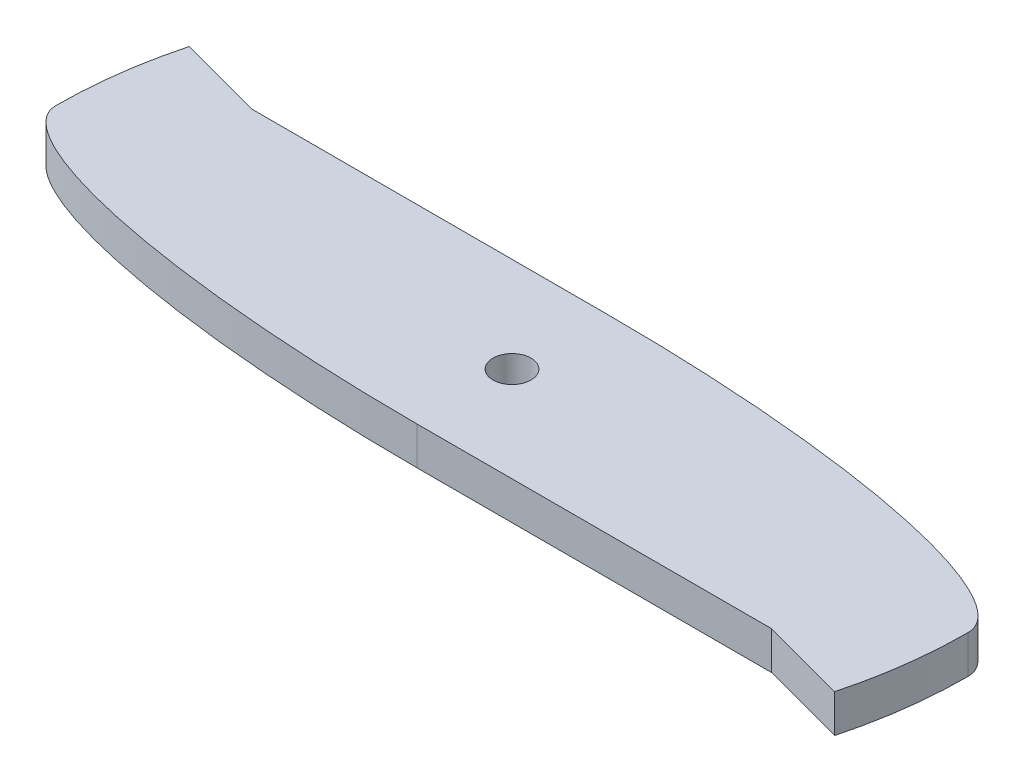
ISO-10303-21;
HEADER;
FILE_DESCRIPTION(('STEP AP214'),'2;1');
FILE_NAME('part.step','',(''),(''),'','','');
FILE_SCHEMA(('AUTOMOTIVE_DESIGN { 1 0 10303 214 1 1 1 1 }'));
ENDSEC;
DATA;
#1=APPLICATION_CONTEXT('core data for automotive mechanical design processes');
#2=APPLICATION_PROTOCOL_DEFINITION('international standard','automotive_design',2000,#1);
#3=PRODUCT_CONTEXT('',#1,'mechanical');
#4=PRODUCT('Part','Part','',(#3));
#5=PRODUCT_RELATED_PRODUCT_CATEGORY('part','',(#4));
#6=PRODUCT_DEFINITION_FORMATION('','',#4);
#7=PRODUCT_DEFINITION_CONTEXT('part definition',#1,'design');
#8=PRODUCT_DEFINITION('design','',#6,#7);
#9=PRODUCT_DEFINITION_SHAPE('','',#8);
#10=(LENGTH_UNIT() NAMED_UNIT(*) SI_UNIT(.MILLI.,.METRE.));
#11=(NAMED_UNIT(*) PLANE_ANGLE_UNIT() SI_UNIT($,.RADIAN.));
#12=(NAMED_UNIT(*) SI_UNIT($,.STERADIAN.) SOLID_ANGLE_UNIT());
#13=UNCERTAINTY_MEASURE_WITH_UNIT(LENGTH_MEASURE(1.E-05),#10,'distance_accuracy_value','');
#14=(GEOMETRIC_REPRESENTATION_CONTEXT(3) GLOBAL_UNCERTAINTY_ASSIGNED_CONTEXT((#13)) GLOBAL_UNIT_ASSIGNED_CONTEXT((#10,
#11,#12)) REPRESENTATION_CONTEXT('',''));
#15=CARTESIAN_POINT('',(0.,0.,0.));
#16=DIRECTION('',(0.,0.,1.));
#17=DIRECTION('',(1.,0.,0.));
#18=AXIS2_PLACEMENT_3D('',#15,#16,#17);
#19=CARTESIAN_POINT('',(0.,3.175,0.));
#20=DIRECTION('',(0.,1.,0.));
#21=DIRECTION('',(0.,0.,1.));
#22=AXIS2_PLACEMENT_3D('',#19,#20,#21);
#23=PLANE('',#22);
#24=CARTESIAN_POINT('',(0.,3.175,0.));
#25=DIRECTION('',(0.,1.,0.));
#26=DIRECTION('',(-1.,0.,0.));
#27=AXIS2_PLACEMENT_3D('',#24,#25,#26);
#28=ELLIPSE('',#27,76.2,15.875);
#29=CARTESIAN_POINT('',(76.2,3.175,0.));
#30=VERTEX_POINT('',#29);
#31=CARTESIAN_POINT('',(0.,3.175,-15.875));
#32=VERTEX_POINT('',#31);
#33=EDGE_CURVE('E146',#30,#32,#28,.T.);
#34=ORIENTED_EDGE('',*,*,#33,.T.);
#35=DIRECTION('',(-1.,0.,0.));
#36=VECTOR('',#35,1.);
#37=CARTESIAN_POINT('',(0.,3.175,-15.875));
#38=LINE('',#37,#36);
#39=CARTESIAN_POINT('',(-59.2463065701573,3.175,-15.875));
#40=VERTEX_POINT('',#39);
#41=EDGE_CURVE('E94',#32,#40,#38,.T.);
#42=ORIENTED_EDGE('',*,*,#41,.T.);
#43=DIRECTION('',(-0.96592582628907,0.,-0.258819045102513));
#44=VECTOR('',#43,1.);
#45=CARTESIAN_POINT('',(-59.2463065701573,3.175,-15.875));
#46=LINE('',#45,#44);
#47=CARTESIAN_POINT('',(-73.6035479632271,3.175,-19.7220112368116));
#48=VERTEX_POINT('',#47);
#49=EDGE_CURVE('E161',#40,#48,#46,.T.);
#50=ORIENTED_EDGE('',*,*,#49,.T.);
#51=CARTESIAN_POINT('',(0.,3.175,0.));
#52=DIRECTION('',(0.,1.,0.));
#53=DIRECTION('',(0.,0.,-1.));
#54=AXIS2_PLACEMENT_3D('',#51,#52,#53);
#55=CIRCLE('',#54,76.2);
#56=CARTESIAN_POINT('',(-76.2,3.175,0.));
#57=VERTEX_POINT('',#56);
#58=EDGE_CURVE('E174',#48,#57,#55,.T.);
#59=ORIENTED_EDGE('',*,*,#58,.T.);
#60=CARTESIAN_POINT('',(0.,3.175,0.));
#61=DIRECTION('',(0.,1.,0.));
#62=DIRECTION('',(1.,0.,0.));
#63=AXIS2_PLACEMENT_3D('',#60,#61,#62);
#64=ELLIPSE('',#63,76.2,15.875);
#65=CARTESIAN_POINT('',(0.,3.175,15.875));
#66=VERTEX_POINT('',#65);
#67=EDGE_CURVE('E113',#57,#66,#64,.T.);
#68=ORIENTED_EDGE('',*,*,#67,.T.);
#69=DIRECTION('',(1.,0.,0.));
#70=VECTOR('',#69,1.);
#71=CARTESIAN_POINT('',(0.,3.175,15.875));
#72=LINE('',#71,#70);
#73=CARTESIAN_POINT('',(59.2463065701575,3.175,15.875));
#74=VERTEX_POINT('',#73);
#75=EDGE_CURVE('E107',#66,#74,#72,.T.);
#76=ORIENTED_EDGE('',*,*,#75,.T.);
#77=DIRECTION('',(0.96592582628907,0.,0.258819045102515));
#78=VECTOR('',#77,1.);
#79=CARTESIAN_POINT('',(59.2463065701575,3.175,15.875));
#80=LINE('',#79,#78);
#81=CARTESIAN_POINT('',(73.6035479632271,3.175,19.7220112368116));
#82=VERTEX_POINT('',#81);
#83=EDGE_CURVE('E111',#74,#82,#80,.T.);
#84=ORIENTED_EDGE('',*,*,#83,.T.);
#85=CARTESIAN_POINT('',(0.,3.175,0.));
#86=DIRECTION('',(0.,1.,0.));
#87=DIRECTION('',(0.,0.,-1.));
#88=AXIS2_PLACEMENT_3D('',#85,#86,#87);
#89=CIRCLE('',#88,76.2);
#90=EDGE_CURVE('E51',#82,#30,#89,.T.);
#91=ORIENTED_EDGE('',*,*,#90,.T.);
#92=EDGE_LOOP('',(#34,#42,#50,#59,#68,#76,#84,#91));
#93=FACE_BOUND('',#92,.T.);
#94=CARTESIAN_POINT('',(0.,3.175,0.));
#95=DIRECTION('',(0.,1.,0.));
#96=DIRECTION('',(0.,0.,1.));
#97=AXIS2_PLACEMENT_3D('',#94,#95,#96);
#98=CIRCLE('',#97,3.175);
#99=CARTESIAN_POINT('',(0.,3.175,3.175));
#100=VERTEX_POINT('',#99);
#101=EDGE_CURVE('E135',#100,#100,#98,.T.);
#102=ORIENTED_EDGE('',*,*,#101,.F.);
#103=EDGE_LOOP('',(#102));
#104=FACE_BOUND('',#103,.T.);
#105=ADVANCED_FACE('F33',(#93,#104),#23,.T.);
#106=CARTESIAN_POINT('',(0.,-3.175,0.));
#107=DIRECTION('',(0.,1.,0.));
#108=DIRECTION('',(0.,0.,1.));
#109=AXIS2_PLACEMENT_3D('',#106,#107,#108);
#110=PLANE('',#109);
#111=CARTESIAN_POINT('',(0.,-3.175,0.));
#112=DIRECTION('',(0.,1.,0.));
#113=DIRECTION('',(-1.,0.,0.));
#114=AXIS2_PLACEMENT_3D('',#111,#112,#113);
#115=ELLIPSE('',#114,76.2,15.875);
#116=CARTESIAN_POINT('',(76.2,-3.175,0.));
#117=VERTEX_POINT('',#116);
#118=CARTESIAN_POINT('',(0.,-3.175,-15.875));
#119=VERTEX_POINT('',#118);
#120=EDGE_CURVE('E131',#117,#119,#115,.T.);
#121=ORIENTED_EDGE('',*,*,#120,.F.);
#122=CARTESIAN_POINT('',(0.,-3.175,0.));
#123=DIRECTION('',(0.,1.,0.));
#124=DIRECTION('',(0.,0.,-1.));
#125=AXIS2_PLACEMENT_3D('',#122,#123,#124);
#126=CIRCLE('',#125,76.2);
#127=CARTESIAN_POINT('',(73.6035479632271,-3.175,19.7220112368116));
#128=VERTEX_POINT('',#127);
#129=EDGE_CURVE('E86',#128,#117,#126,.T.);
#130=ORIENTED_EDGE('',*,*,#129,.F.);
#131=DIRECTION('',(0.96592582628907,0.,0.258819045102515));
#132=VECTOR('',#131,1.);
#133=CARTESIAN_POINT('',(59.2463065701575,-3.175,15.875));
#134=LINE('',#133,#132);
#135=CARTESIAN_POINT('',(59.2463065701575,-3.175,15.875));
#136=VERTEX_POINT('',#135);
#137=EDGE_CURVE('E80',#136,#128,#134,.T.);
#138=ORIENTED_EDGE('',*,*,#137,.F.);
#139=DIRECTION('',(1.,0.,0.));
#140=VECTOR('',#139,1.);
#141=CARTESIAN_POINT('',(0.,-3.175,15.875));
#142=LINE('',#141,#140);
#143=CARTESIAN_POINT('',(0.,-3.175,15.875));
#144=VERTEX_POINT('',#143);
#145=EDGE_CURVE('E121',#144,#136,#142,.T.);
#146=ORIENTED_EDGE('',*,*,#145,.F.);
#147=CARTESIAN_POINT('',(0.,-3.175,0.));
#148=DIRECTION('',(0.,1.,0.));
#149=DIRECTION('',(1.,0.,0.));
#150=AXIS2_PLACEMENT_3D('',#147,#148,#149);
#151=ELLIPSE('',#150,76.2,15.875);
#152=CARTESIAN_POINT('',(-76.2,-3.175,0.));
#153=VERTEX_POINT('',#152);
#154=EDGE_CURVE('E141',#153,#144,#151,.T.);
#155=ORIENTED_EDGE('',*,*,#154,.F.);
#156=CARTESIAN_POINT('',(0.,-3.175,0.));
#157=DIRECTION('',(0.,1.,0.));
#158=DIRECTION('',(0.,0.,-1.));
#159=AXIS2_PLACEMENT_3D('',#156,#157,#158);
#160=CIRCLE('',#159,76.2);
#161=CARTESIAN_POINT('',(-73.6035479632271,-3.175,-19.7220112368116));
#162=VERTEX_POINT('',#161);
#163=EDGE_CURVE('E139',#162,#153,#160,.T.);
#164=ORIENTED_EDGE('',*,*,#163,.F.);
#165=DIRECTION('',(-0.96592582628907,0.,-0.258819045102513));
#166=VECTOR('',#165,1.);
#167=CARTESIAN_POINT('',(-59.2463065701573,-3.175,-15.875));
#168=LINE('',#167,#166);
#169=CARTESIAN_POINT('',(-59.2463065701573,-3.175,-15.875));
#170=VERTEX_POINT('',#169);
#171=EDGE_CURVE('E137',#170,#162,#168,.T.);
#172=ORIENTED_EDGE('',*,*,#171,.F.);
#173=DIRECTION('',(-1.,0.,0.));
#174=VECTOR('',#173,1.);
#175=CARTESIAN_POINT('',(0.,-3.175,-15.875));
#176=LINE('',#175,#174);
#177=EDGE_CURVE('E134',#119,#170,#176,.T.);
#178=ORIENTED_EDGE('',*,*,#177,.F.);
#179=EDGE_LOOP('',(#121,#130,#138,#146,#155,#164,#172,#178));
#180=FACE_BOUND('',#179,.T.);
#181=CARTESIAN_POINT('',(0.,-3.175,0.));
#182=DIRECTION('',(0.,1.,0.));
#183=DIRECTION('',(0.,0.,1.));
#184=AXIS2_PLACEMENT_3D('',#181,#182,#183);
#185=CIRCLE('',#184,3.175);
#186=CARTESIAN_POINT('',(0.,-3.175,3.175));
#187=VERTEX_POINT('',#186);
#188=EDGE_CURVE('E274',#187,#187,#185,.T.);
#189=ORIENTED_EDGE('',*,*,#188,.T.);
#190=EDGE_LOOP('',(#189));
#191=FACE_BOUND('',#190,.T.);
#192=ADVANCED_FACE('F165',(#180,#191),#110,.F.);
#193=DIRECTION('',(0.,-1.,0.));
#194=VECTOR('',#193,1.);
#195=SURFACE_OF_LINEAR_EXTRUSION('',#28,#194);
#196=ORIENTED_EDGE('',*,*,#120,.T.);
#197=DIRECTION('',(0.,-1.,0.));
#198=VECTOR('',#197,1.);
#199=CARTESIAN_POINT('',(0.,3.175,-15.875));
#200=LINE('',#199,#198);
#201=EDGE_CURVE('E11',#32,#119,#200,.T.);
#202=ORIENTED_EDGE('',*,*,#201,.F.);
#203=ORIENTED_EDGE('',*,*,#33,.F.);
#204=DIRECTION('',(0.,-1.,0.));
#205=VECTOR('',#204,1.);
#206=CARTESIAN_POINT('',(76.2,3.175,0.));
#207=LINE('',#206,#205);
#208=EDGE_CURVE('E127',#30,#117,#207,.T.);
#209=ORIENTED_EDGE('',*,*,#208,.T.);
#210=EDGE_LOOP('',(#196,#202,#203,#209));
#211=FACE_BOUND('',#210,.T.);
#212=ADVANCED_FACE('F35',(#211),#195,.F.);
#213=CARTESIAN_POINT('',(0.,3.175,-15.875));
#214=DIRECTION('',(0.,0.,1.));
#215=DIRECTION('',(1.,0.,0.));
#216=AXIS2_PLACEMENT_3D('',#213,#214,#215);
#217=PLANE('',#216);
#218=ORIENTED_EDGE('',*,*,#177,.T.);
#219=DIRECTION('',(0.,-1.,0.));
#220=VECTOR('',#219,1.);
#221=CARTESIAN_POINT('',(-59.2463065701573,3.175,-15.875));
#222=LINE('',#221,#220);
#223=EDGE_CURVE('E43',#40,#170,#222,.T.);
#224=ORIENTED_EDGE('',*,*,#223,.F.);
#225=ORIENTED_EDGE('',*,*,#41,.F.);
#226=ORIENTED_EDGE('',*,*,#201,.T.);
#227=EDGE_LOOP('',(#218,#224,#225,#226));
#228=FACE_BOUND('',#227,.T.);
#229=ADVANCED_FACE('F186',(#228),#217,.F.);
#230=CARTESIAN_POINT('',(-59.2463065701573,3.175,-15.875));
#231=DIRECTION('',(-0.258819045102513,0.,0.96592582628907));
#232=DIRECTION('',(0.965925826289071,0.,0.258819045102513));
#233=AXIS2_PLACEMENT_3D('',#230,#231,#232);
#234=PLANE('',#233);
#235=ORIENTED_EDGE('',*,*,#171,.T.);
#236=DIRECTION('',(0.,-1.,0.));
#237=VECTOR('',#236,1.);
#238=CARTESIAN_POINT('',(-73.6035479632271,3.175,-19.7220112368116));
#239=LINE('',#238,#237);
#240=EDGE_CURVE('E153',#48,#162,#239,.T.);
#241=ORIENTED_EDGE('',*,*,#240,.F.);
#242=ORIENTED_EDGE('',*,*,#49,.F.);
#243=ORIENTED_EDGE('',*,*,#223,.T.);
#244=EDGE_LOOP('',(#235,#241,#242,#243));
#245=FACE_BOUND('',#244,.T.);
#246=ADVANCED_FACE('F159',(#245),#234,.F.);
#247=CARTESIAN_POINT('',(0.,3.175,0.));
#248=DIRECTION('',(0.,-1.,0.));
#249=DIRECTION('',(0.,0.,-1.));
#250=AXIS2_PLACEMENT_3D('',#247,#248,#249);
#251=CYLINDRICAL_SURFACE('',#250,76.2);
#252=ORIENTED_EDGE('',*,*,#163,.T.);
#253=DIRECTION('',(0.,-1.,0.));
#254=VECTOR('',#253,1.);
#255=CARTESIAN_POINT('',(-76.2,3.175,0.));
#256=LINE('',#255,#254);
#257=EDGE_CURVE('E150',#57,#153,#256,.T.);
#258=ORIENTED_EDGE('',*,*,#257,.F.);
#259=ORIENTED_EDGE('',*,*,#58,.F.);
#260=ORIENTED_EDGE('',*,*,#240,.T.);
#261=EDGE_LOOP('',(#252,#258,#259,#260));
#262=FACE_BOUND('',#261,.T.);
#263=ADVANCED_FACE('F170',(#262),#251,.T.);
#264=DIRECTION('',(0.,-1.,0.));
#265=VECTOR('',#264,1.);
#266=SURFACE_OF_LINEAR_EXTRUSION('',#64,#265);
#267=ORIENTED_EDGE('',*,*,#154,.T.);
#268=DIRECTION('',(0.,-1.,0.));
#269=VECTOR('',#268,1.);
#270=CARTESIAN_POINT('',(0.,3.175,15.875));
#271=LINE('',#270,#269);
#272=EDGE_CURVE('E122',#66,#144,#271,.T.);
#273=ORIENTED_EDGE('',*,*,#272,.F.);
#274=ORIENTED_EDGE('',*,*,#67,.F.);
#275=ORIENTED_EDGE('',*,*,#257,.T.);
#276=EDGE_LOOP('',(#267,#273,#274,#275));
#277=FACE_BOUND('',#276,.T.);
#278=ADVANCED_FACE('F173',(#277),#266,.F.);
#279=CARTESIAN_POINT('',(0.,3.175,15.875));
#280=DIRECTION('',(0.,0.,-1.));
#281=DIRECTION('',(-1.,0.,0.));
#282=AXIS2_PLACEMENT_3D('',#279,#280,#281);
#283=PLANE('',#282);
#284=ORIENTED_EDGE('',*,*,#145,.T.);
#285=DIRECTION('',(0.,-1.,0.));
#286=VECTOR('',#285,1.);
#287=CARTESIAN_POINT('',(59.2463065701575,3.175,15.875));
#288=LINE('',#287,#286);
#289=EDGE_CURVE('E118',#74,#136,#288,.T.);
#290=ORIENTED_EDGE('',*,*,#289,.F.);
#291=ORIENTED_EDGE('',*,*,#75,.F.);
#292=ORIENTED_EDGE('',*,*,#272,.T.);
#293=EDGE_LOOP('',(#284,#290,#291,#292));
#294=FACE_BOUND('',#293,.T.);
#295=ADVANCED_FACE('F119',(#294),#283,.F.);
#296=CARTESIAN_POINT('',(59.2463065701575,3.175,15.875));
#297=DIRECTION('',(0.258819045102515,0.,-0.96592582628907));
#298=DIRECTION('',(-0.96592582628907,0.,-0.258819045102515));
#299=AXIS2_PLACEMENT_3D('',#296,#297,#298);
#300=PLANE('',#299);
#301=ORIENTED_EDGE('',*,*,#137,.T.);
#302=DIRECTION('',(0.,-1.,0.));
#303=VECTOR('',#302,1.);
#304=CARTESIAN_POINT('',(73.6035479632271,3.175,19.7220112368116));
#305=LINE('',#304,#303);
#306=EDGE_CURVE('E123',#82,#128,#305,.T.);
#307=ORIENTED_EDGE('',*,*,#306,.F.);
#308=ORIENTED_EDGE('',*,*,#83,.F.);
#309=ORIENTED_EDGE('',*,*,#289,.T.);
#310=EDGE_LOOP('',(#301,#307,#308,#309));
#311=FACE_BOUND('',#310,.T.);
#312=ADVANCED_FACE('F125',(#311),#300,.F.);
#313=CARTESIAN_POINT('',(0.,3.175,0.));
#314=DIRECTION('',(0.,-1.,0.));
#315=DIRECTION('',(0.,0.,-1.));
#316=AXIS2_PLACEMENT_3D('',#313,#314,#315);
#317=CYLINDRICAL_SURFACE('',#316,76.2);
#318=ORIENTED_EDGE('',*,*,#129,.T.);
#319=ORIENTED_EDGE('',*,*,#208,.F.);
#320=ORIENTED_EDGE('',*,*,#90,.F.);
#321=ORIENTED_EDGE('',*,*,#306,.T.);
#322=EDGE_LOOP('',(#318,#319,#320,#321));
#323=FACE_BOUND('',#322,.T.);
#324=ADVANCED_FACE('F201',(#323),#317,.T.);
#325=CARTESIAN_POINT('',(0.,3.175,0.));
#326=DIRECTION('',(0.,-1.,0.));
#327=DIRECTION('',(0.,0.,-1.));
#328=AXIS2_PLACEMENT_3D('',#325,#326,#327);
#329=CYLINDRICAL_SURFACE('',#328,3.175);
#330=ORIENTED_EDGE('',*,*,#101,.T.);
#331=EDGE_LOOP('',(#330));
#332=FACE_BOUND('',#331,.T.);
#333=ORIENTED_EDGE('',*,*,#188,.F.);
#334=EDGE_LOOP('',(#333));
#335=FACE_BOUND('',#334,.T.);
#336=ADVANCED_FACE('F199',(#332,#335),#329,.F.);
#337=CLOSED_SHELL('',(#105,#192,#212,#229,#246,#263,#278,#295,#312,#324,#336));
#338=MANIFOLD_SOLID_BREP('B2',#337);
#339=ADVANCED_BREP_SHAPE_REPRESENTATION('',(#18,#338),#14);
#340=SHAPE_DEFINITION_REPRESENTATION(#9,#339);
ENDSEC;
END-ISO-10303-21;
